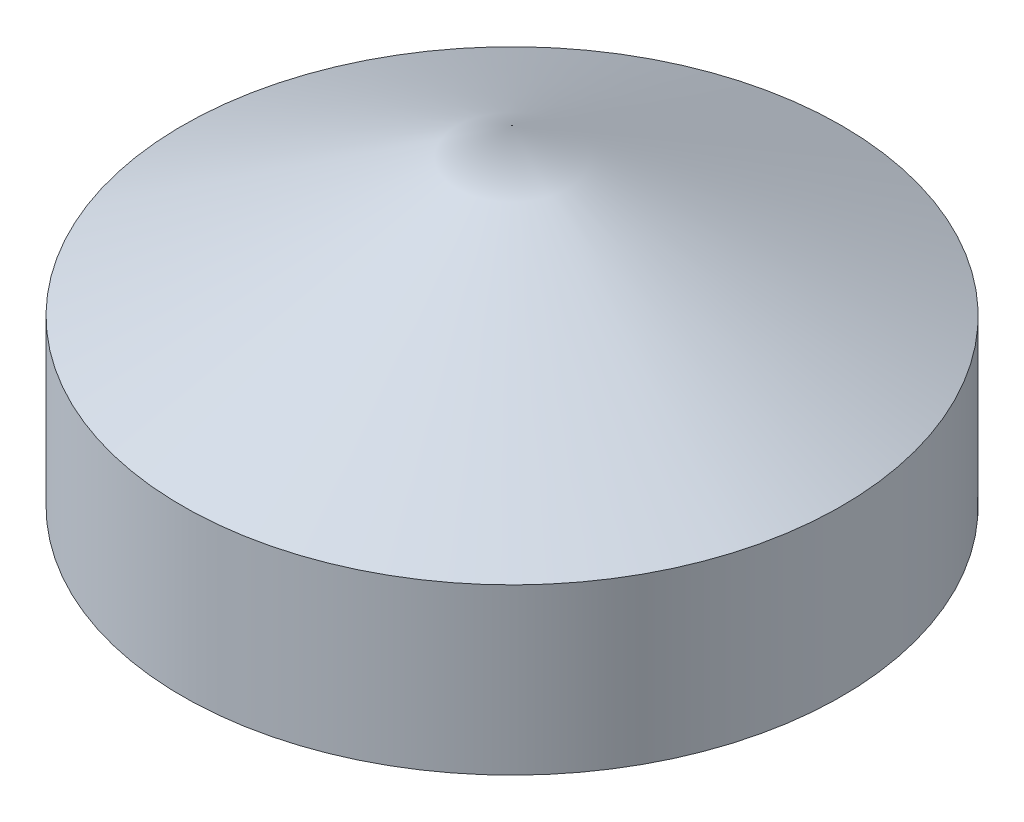
ISO-10303-21;
HEADER;
FILE_DESCRIPTION(('STEP AP214'),'2;1');
FILE_NAME('part.step','',(''),(''),'','','');
FILE_SCHEMA(('AUTOMOTIVE_DESIGN { 1 0 10303 214 1 1 1 1 }'));
ENDSEC;
DATA;
#1=APPLICATION_CONTEXT('core data for automotive mechanical design processes');
#2=APPLICATION_PROTOCOL_DEFINITION('international standard','automotive_design',2000,#1);
#3=PRODUCT_CONTEXT('',#1,'mechanical');
#4=PRODUCT('Part','Part','',(#3));
#5=PRODUCT_RELATED_PRODUCT_CATEGORY('part','',(#4));
#6=PRODUCT_DEFINITION_FORMATION('','',#4);
#7=PRODUCT_DEFINITION_CONTEXT('part definition',#1,'design');
#8=PRODUCT_DEFINITION('design','',#6,#7);
#9=PRODUCT_DEFINITION_SHAPE('','',#8);
#10=(LENGTH_UNIT() NAMED_UNIT(*) SI_UNIT(.MILLI.,.METRE.));
#11=(NAMED_UNIT(*) PLANE_ANGLE_UNIT() SI_UNIT($,.RADIAN.));
#12=(NAMED_UNIT(*) SI_UNIT($,.STERADIAN.) SOLID_ANGLE_UNIT());
#13=UNCERTAINTY_MEASURE_WITH_UNIT(LENGTH_MEASURE(1.E-05),#10,'distance_accuracy_value','');
#14=(GEOMETRIC_REPRESENTATION_CONTEXT(3) GLOBAL_UNCERTAINTY_ASSIGNED_CONTEXT((#13)) GLOBAL_UNIT_ASSIGNED_CONTEXT((#10,
#11,#12)) REPRESENTATION_CONTEXT('',''));
#15=CARTESIAN_POINT('',(0.,0.,0.));
#16=DIRECTION('',(0.,0.,1.));
#17=DIRECTION('',(1.,0.,0.));
#18=AXIS2_PLACEMENT_3D('',#15,#16,#17);
#19=CARTESIAN_POINT('',(0.,5.,0.));
#20=DIRECTION('',(0.,-1.,0.));
#21=DIRECTION('',(0.,0.,-1.));
#22=AXIS2_PLACEMENT_3D('',#19,#20,#21);
#23=CONICAL_SURFACE('',#22,10.,1.10714871779409);
#24=CARTESIAN_POINT('',(0.,10.,0.));
#25=VERTEX_POINT('',#24);
#26=VERTEX_LOOP('',#25);
#27=FACE_BOUND('',#26,.T.);
#28=CARTESIAN_POINT('',(0.,5.,0.));
#29=DIRECTION('',(0.,-1.,0.));
#30=DIRECTION('',(0.,0.,-1.));
#31=AXIS2_PLACEMENT_3D('',#28,#29,#30);
#32=CIRCLE('',#31,10.);
#33=CARTESIAN_POINT('',(0.,5.,-10.));
#34=VERTEX_POINT('',#33);
#35=EDGE_CURVE('E11',#34,#34,#32,.T.);
#36=ORIENTED_EDGE('',*,*,#35,.F.);
#37=EDGE_LOOP('',(#36));
#38=FACE_BOUND('',#37,.T.);
#39=ADVANCED_FACE('F33',(#27,#38),#23,.T.);
#40=CARTESIAN_POINT('',(0.,0.,0.));
#41=DIRECTION('',(0.,-1.,0.));
#42=DIRECTION('',(0.,0.,-1.));
#43=AXIS2_PLACEMENT_3D('',#40,#41,#42);
#44=CYLINDRICAL_SURFACE('',#43,10.);
#45=ORIENTED_EDGE('',*,*,#35,.T.);
#46=EDGE_LOOP('',(#45));
#47=FACE_BOUND('',#46,.T.);
#48=CARTESIAN_POINT('',(0.,0.,0.));
#49=DIRECTION('',(0.,-1.,0.));
#50=DIRECTION('',(0.,0.,-1.));
#51=AXIS2_PLACEMENT_3D('',#48,#49,#50);
#52=CIRCLE('',#51,10.);
#53=CARTESIAN_POINT('',(0.,0.,-10.));
#54=VERTEX_POINT('',#53);
#55=EDGE_CURVE('E39',#54,#54,#52,.T.);
#56=ORIENTED_EDGE('',*,*,#55,.F.);
#57=EDGE_LOOP('',(#56));
#58=FACE_BOUND('',#57,.T.);
#59=ADVANCED_FACE('F44',(#47,#58),#44,.T.);
#60=CARTESIAN_POINT('',(0.,0.,0.));
#61=DIRECTION('',(0.,-1.,0.));
#62=DIRECTION('',(0.,0.,-1.));
#63=AXIS2_PLACEMENT_3D('',#60,#61,#62);
#64=PLANE('',#63);
#65=ORIENTED_EDGE('',*,*,#55,.T.);
#66=EDGE_LOOP('',(#65));
#67=FACE_BOUND('',#66,.T.);
#68=ADVANCED_FACE('F49',(#67),#64,.T.);
#69=CLOSED_SHELL('',(#39,#59,#68));
#70=MANIFOLD_SOLID_BREP('B2',#69);
#71=ADVANCED_BREP_SHAPE_REPRESENTATION('',(#18,#70),#14);
#72=SHAPE_DEFINITION_REPRESENTATION(#9,#71);
ENDSEC;
END-ISO-10303-21;
